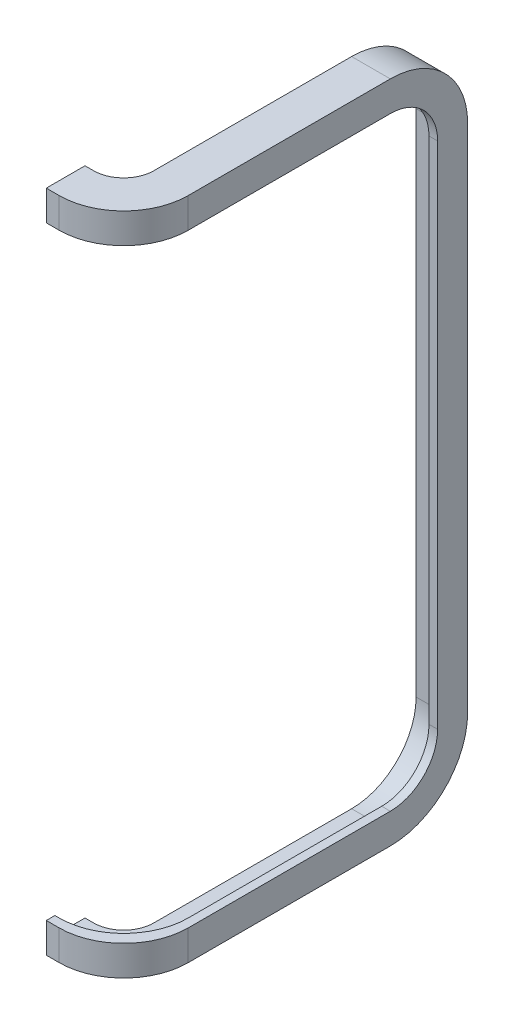
ISO-10303-21;
HEADER;
FILE_DESCRIPTION(('STEP AP214'),'2;1');
FILE_NAME('part.step','',(''),(''),'','','');
FILE_SCHEMA(('AUTOMOTIVE_DESIGN { 1 0 10303 214 1 1 1 1 }'));
ENDSEC;
DATA;
#1=APPLICATION_CONTEXT('core data for automotive mechanical design processes');
#2=APPLICATION_PROTOCOL_DEFINITION('international standard','automotive_design',2000,#1);
#3=PRODUCT_CONTEXT('',#1,'mechanical');
#4=PRODUCT('Part','Part','',(#3));
#5=PRODUCT_RELATED_PRODUCT_CATEGORY('part','',(#4));
#6=PRODUCT_DEFINITION_FORMATION('','',#4);
#7=PRODUCT_DEFINITION_CONTEXT('part definition',#1,'design');
#8=PRODUCT_DEFINITION('design','',#6,#7);
#9=PRODUCT_DEFINITION_SHAPE('','',#8);
#10=(LENGTH_UNIT() NAMED_UNIT(*) SI_UNIT(.MILLI.,.METRE.));
#11=(NAMED_UNIT(*) PLANE_ANGLE_UNIT() SI_UNIT($,.RADIAN.));
#12=(NAMED_UNIT(*) SI_UNIT($,.STERADIAN.) SOLID_ANGLE_UNIT());
#13=UNCERTAINTY_MEASURE_WITH_UNIT(LENGTH_MEASURE(1.E-05),#10,'distance_accuracy_value','');
#14=(GEOMETRIC_REPRESENTATION_CONTEXT(3) GLOBAL_UNCERTAINTY_ASSIGNED_CONTEXT((#13)) GLOBAL_UNIT_ASSIGNED_CONTEXT((#10,
#11,#12)) REPRESENTATION_CONTEXT('',''));
#15=CARTESIAN_POINT('',(0.,0.,0.));
#16=DIRECTION('',(0.,0.,1.));
#17=DIRECTION('',(1.,0.,0.));
#18=AXIS2_PLACEMENT_3D('',#15,#16,#17);
#19=CARTESIAN_POINT('',(112.5,-3.,0.));
#20=DIRECTION('',(0.,1.,0.));
#21=DIRECTION('',(0.,0.,1.));
#22=AXIS2_PLACEMENT_3D('',#19,#20,#21);
#23=PLANE('',#22);
#24=DIRECTION('',(0.,0.,-1.));
#25=VECTOR('',#24,1.);
#26=CARTESIAN_POINT('',(114.5,-3.,0.));
#27=LINE('',#26,#25);
#28=CARTESIAN_POINT('',(114.5,-3.,-13.));
#29=VERTEX_POINT('',#28);
#30=CARTESIAN_POINT('',(114.5,-3.,-60.));
#31=VERTEX_POINT('',#30);
#32=EDGE_CURVE('E316',#29,#31,#27,.T.);
#33=ORIENTED_EDGE('',*,*,#32,.F.);
#34=CARTESIAN_POINT('',(99.5,-3.,-13.));
#35=DIRECTION('',(0.,1.,0.));
#36=DIRECTION('',(0.,0.,1.));
#37=AXIS2_PLACEMENT_3D('',#34,#35,#36);
#38=CIRCLE('',#37,15.);
#39=CARTESIAN_POINT('',(99.5,-3.,2.00000000000001));
#40=VERTEX_POINT('',#39);
#41=EDGE_CURVE('E464',#29,#40,#38,.F.);
#42=ORIENTED_EDGE('',*,*,#41,.T.);
#43=DIRECTION('',(1.,0.,0.));
#44=VECTOR('',#43,1.);
#45=CARTESIAN_POINT('',(96.5,-3.,2.00000000000001));
#46=LINE('',#45,#44);
#47=CARTESIAN_POINT('',(96.5,-3.,2.00000000000001));
#48=VERTEX_POINT('',#47);
#49=EDGE_CURVE('E286',#48,#40,#46,.T.);
#50=ORIENTED_EDGE('',*,*,#49,.F.);
#51=DIRECTION('',(0.,0.,-1.));
#52=VECTOR('',#51,1.);
#53=CARTESIAN_POINT('',(96.5,-3.,-7.));
#54=LINE('',#53,#52);
#55=CARTESIAN_POINT('',(96.5,-3.,-7.));
#56=VERTEX_POINT('',#55);
#57=EDGE_CURVE('E306',#48,#56,#54,.T.);
#58=ORIENTED_EDGE('',*,*,#57,.T.);
#59=DIRECTION('',(1.,0.,0.));
#60=VECTOR('',#59,1.);
#61=CARTESIAN_POINT('',(96.5,-3.,-7.));
#62=LINE('',#61,#60);
#63=CARTESIAN_POINT('',(98.5,-3.,-7.));
#64=VERTEX_POINT('',#63);
#65=EDGE_CURVE('E310',#56,#64,#62,.T.);
#66=ORIENTED_EDGE('',*,*,#65,.T.);
#67=CARTESIAN_POINT('',(98.5,-3.,-14.));
#68=DIRECTION('',(0.,1.,0.));
#69=DIRECTION('',(0.,0.,1.));
#70=AXIS2_PLACEMENT_3D('',#67,#68,#69);
#71=CIRCLE('',#70,7.);
#72=CARTESIAN_POINT('',(105.5,-3.,-14.));
#73=VERTEX_POINT('',#72);
#74=EDGE_CURVE('E444',#64,#73,#71,.T.);
#75=ORIENTED_EDGE('',*,*,#74,.T.);
#76=DIRECTION('',(0.,0.,-1.));
#77=VECTOR('',#76,1.);
#78=CARTESIAN_POINT('',(105.5,-3.,0.));
#79=LINE('',#78,#77);
#80=CARTESIAN_POINT('',(105.5,-3.,-60.));
#81=VERTEX_POINT('',#80);
#82=EDGE_CURVE('E364',#73,#81,#79,.T.);
#83=ORIENTED_EDGE('',*,*,#82,.T.);
#84=DIRECTION('',(-1.,0.,0.));
#85=VECTOR('',#84,1.);
#86=CARTESIAN_POINT('',(112.5,-3.,-60.));
#87=LINE('',#86,#85);
#88=EDGE_CURVE('E425',#31,#81,#87,.T.);
#89=ORIENTED_EDGE('',*,*,#88,.F.);
#90=EDGE_LOOP('',(#33,#42,#50,#58,#66,#75,#83,#89));
#91=FACE_BOUND('',#90,.T.);
#92=ADVANCED_FACE('F39',(#91),#23,.F.);
#93=CARTESIAN_POINT('',(112.5,15.,-60.));
#94=DIRECTION('',(-1.,0.,0.));
#95=DIRECTION('',(0.,0.,1.));
#96=AXIS2_PLACEMENT_3D('',#93,#94,#95);
#97=CYLINDRICAL_SURFACE('',#96,18.);
#98=CARTESIAN_POINT('',(105.5,15.,-60.));
#99=DIRECTION('',(1.,0.,0.));
#100=DIRECTION('',(0.,0.,-1.));
#101=AXIS2_PLACEMENT_3D('',#98,#99,#100);
#102=CIRCLE('',#101,18.);
#103=CARTESIAN_POINT('',(105.5,15.,-78.));
#104=VERTEX_POINT('',#103);
#105=EDGE_CURVE('E382',#81,#104,#102,.T.);
#106=ORIENTED_EDGE('',*,*,#105,.T.);
#107=DIRECTION('',(-1.,0.,0.));
#108=VECTOR('',#107,1.);
#109=CARTESIAN_POINT('',(112.5,15.,-78.));
#110=LINE('',#109,#108);
#111=CARTESIAN_POINT('',(114.5,15.,-78.));
#112=VERTEX_POINT('',#111);
#113=EDGE_CURVE('E422',#112,#104,#110,.T.);
#114=ORIENTED_EDGE('',*,*,#113,.F.);
#115=CARTESIAN_POINT('',(114.5,15.,-60.));
#116=DIRECTION('',(1.,0.,0.));
#117=DIRECTION('',(0.,0.,-1.));
#118=AXIS2_PLACEMENT_3D('',#115,#116,#117);
#119=CIRCLE('',#118,18.);
#120=EDGE_CURVE('E318',#31,#112,#119,.T.);
#121=ORIENTED_EDGE('',*,*,#120,.F.);
#122=ORIENTED_EDGE('',*,*,#88,.T.);
#123=EDGE_LOOP('',(#106,#114,#121,#122));
#124=FACE_BOUND('',#123,.T.);
#125=ADVANCED_FACE('F569',(#124),#97,.T.);
#126=CARTESIAN_POINT('',(112.5,15.,-78.));
#127=DIRECTION('',(0.,0.,1.));
#128=DIRECTION('',(1.,0.,0.));
#129=AXIS2_PLACEMENT_3D('',#126,#127,#128);
#130=PLANE('',#129);
#131=DIRECTION('',(0.,1.,0.));
#132=VECTOR('',#131,1.);
#133=CARTESIAN_POINT('',(105.5,15.,-78.));
#134=LINE('',#133,#132);
#135=CARTESIAN_POINT('',(105.5,133.5,-78.));
#136=VERTEX_POINT('',#135);
#137=EDGE_CURVE('E384',#104,#136,#134,.T.);
#138=ORIENTED_EDGE('',*,*,#137,.T.);
#139=DIRECTION('',(-1.,0.,0.));
#140=VECTOR('',#139,1.);
#141=CARTESIAN_POINT('',(112.5,133.5,-78.));
#142=LINE('',#141,#140);
#143=CARTESIAN_POINT('',(114.5,133.5,-78.));
#144=VERTEX_POINT('',#143);
#145=EDGE_CURVE('E419',#144,#136,#142,.T.);
#146=ORIENTED_EDGE('',*,*,#145,.F.);
#147=DIRECTION('',(0.,1.,0.));
#148=VECTOR('',#147,1.);
#149=CARTESIAN_POINT('',(114.5,0.,-78.));
#150=LINE('',#149,#148);
#151=EDGE_CURVE('E322',#112,#144,#150,.T.);
#152=ORIENTED_EDGE('',*,*,#151,.F.);
#153=ORIENTED_EDGE('',*,*,#113,.T.);
#154=EDGE_LOOP('',(#138,#146,#152,#153));
#155=FACE_BOUND('',#154,.T.);
#156=ADVANCED_FACE('F571',(#155),#130,.F.);
#157=CARTESIAN_POINT('',(112.5,133.5,-60.));
#158=DIRECTION('',(-1.,0.,0.));
#159=DIRECTION('',(0.,0.,1.));
#160=AXIS2_PLACEMENT_3D('',#157,#158,#159);
#161=CYLINDRICAL_SURFACE('',#160,18.);
#162=CARTESIAN_POINT('',(105.5,133.5,-60.));
#163=DIRECTION('',(1.,0.,0.));
#164=DIRECTION('',(0.,0.,-1.));
#165=AXIS2_PLACEMENT_3D('',#162,#163,#164);
#166=CIRCLE('',#165,18.);
#167=CARTESIAN_POINT('',(105.5,151.5,-60.));
#168=VERTEX_POINT('',#167);
#169=EDGE_CURVE('E386',#136,#168,#166,.T.);
#170=ORIENTED_EDGE('',*,*,#169,.T.);
#171=DIRECTION('',(-1.,0.,0.));
#172=VECTOR('',#171,1.);
#173=CARTESIAN_POINT('',(112.5,151.5,-60.));
#174=LINE('',#173,#172);
#175=CARTESIAN_POINT('',(114.5,151.5,-60.));
#176=VERTEX_POINT('',#175);
#177=EDGE_CURVE('E416',#176,#168,#174,.T.);
#178=ORIENTED_EDGE('',*,*,#177,.F.);
#179=CARTESIAN_POINT('',(114.5,133.5,-60.));
#180=DIRECTION('',(1.,0.,0.));
#181=DIRECTION('',(0.,0.,-1.));
#182=AXIS2_PLACEMENT_3D('',#179,#180,#181);
#183=CIRCLE('',#182,18.);
#184=EDGE_CURVE('E325',#144,#176,#183,.T.);
#185=ORIENTED_EDGE('',*,*,#184,.F.);
#186=ORIENTED_EDGE('',*,*,#145,.T.);
#187=EDGE_LOOP('',(#170,#178,#185,#186));
#188=FACE_BOUND('',#187,.T.);
#189=ADVANCED_FACE('F486',(#188),#161,.T.);
#190=CARTESIAN_POINT('',(112.5,151.5,-60.));
#191=DIRECTION('',(0.,-1.,0.));
#192=DIRECTION('',(0.,0.,-1.));
#193=AXIS2_PLACEMENT_3D('',#190,#191,#192);
#194=PLANE('',#193);
#195=DIRECTION('',(1.,0.,0.));
#196=VECTOR('',#195,1.);
#197=CARTESIAN_POINT('',(96.5,151.5,2.00000000000002));
#198=LINE('',#197,#196);
#199=CARTESIAN_POINT('',(96.5,151.5,2.00000000000002));
#200=VERTEX_POINT('',#199);
#201=CARTESIAN_POINT('',(99.5,151.5,2.00000000000002));
#202=VERTEX_POINT('',#201);
#203=EDGE_CURVE('E241',#200,#202,#198,.T.);
#204=ORIENTED_EDGE('',*,*,#203,.T.);
#205=CARTESIAN_POINT('',(99.5,151.5,-13.));
#206=DIRECTION('',(0.,-1.,0.));
#207=DIRECTION('',(0.,0.,-1.));
#208=AXIS2_PLACEMENT_3D('',#205,#206,#207);
#209=CIRCLE('',#208,15.);
#210=CARTESIAN_POINT('',(114.5,151.5,-13.));
#211=VERTEX_POINT('',#210);
#212=EDGE_CURVE('E462',#202,#211,#209,.F.);
#213=ORIENTED_EDGE('',*,*,#212,.T.);
#214=DIRECTION('',(0.,0.,1.));
#215=VECTOR('',#214,1.);
#216=CARTESIAN_POINT('',(114.5,151.5,0.));
#217=LINE('',#216,#215);
#218=EDGE_CURVE('E328',#176,#211,#217,.T.);
#219=ORIENTED_EDGE('',*,*,#218,.F.);
#220=ORIENTED_EDGE('',*,*,#177,.T.);
#221=DIRECTION('',(0.,0.,1.));
#222=VECTOR('',#221,1.);
#223=CARTESIAN_POINT('',(105.5,151.5,-60.));
#224=LINE('',#223,#222);
#225=CARTESIAN_POINT('',(105.5,151.5,-14.));
#226=VERTEX_POINT('',#225);
#227=EDGE_CURVE('E388',#168,#226,#224,.T.);
#228=ORIENTED_EDGE('',*,*,#227,.T.);
#229=CARTESIAN_POINT('',(98.5,151.5,-14.));
#230=DIRECTION('',(0.,-1.,0.));
#231=DIRECTION('',(0.,0.,-1.));
#232=AXIS2_PLACEMENT_3D('',#229,#230,#231);
#233=CIRCLE('',#232,7.);
#234=CARTESIAN_POINT('',(98.5,151.5,-7.));
#235=VERTEX_POINT('',#234);
#236=EDGE_CURVE('E438',#226,#235,#233,.T.);
#237=ORIENTED_EDGE('',*,*,#236,.T.);
#238=DIRECTION('',(1.,0.,0.));
#239=VECTOR('',#238,1.);
#240=CARTESIAN_POINT('',(96.5,151.5,-7.));
#241=LINE('',#240,#239);
#242=CARTESIAN_POINT('',(96.5,151.5,-7.));
#243=VERTEX_POINT('',#242);
#244=EDGE_CURVE('E244',#243,#235,#241,.T.);
#245=ORIENTED_EDGE('',*,*,#244,.F.);
#246=DIRECTION('',(0.,0.,1.));
#247=VECTOR('',#246,1.);
#248=CARTESIAN_POINT('',(96.5,151.5,0.));
#249=LINE('',#248,#247);
#250=EDGE_CURVE('E238',#243,#200,#249,.T.);
#251=ORIENTED_EDGE('',*,*,#250,.T.);
#252=EDGE_LOOP('',(#204,#213,#219,#220,#228,#237,#245,#251));
#253=FACE_BOUND('',#252,.T.);
#254=ADVANCED_FACE('F240',(#253),#194,.F.);
#255=CARTESIAN_POINT('',(112.5,148.5,0.));
#256=DIRECTION('',(0.,1.,0.));
#257=DIRECTION('',(0.,0.,1.));
#258=AXIS2_PLACEMENT_3D('',#255,#256,#257);
#259=PLANE('',#258);
#260=DIRECTION('',(0.,0.,-1.));
#261=VECTOR('',#260,1.);
#262=CARTESIAN_POINT('',(112.5,148.5,0.));
#263=LINE('',#262,#261);
#264=CARTESIAN_POINT('',(112.5,148.5,-15.));
#265=VERTEX_POINT('',#264);
#266=CARTESIAN_POINT('',(112.5,148.5,-60.));
#267=VERTEX_POINT('',#266);
#268=EDGE_CURVE('E365',#265,#267,#263,.T.);
#269=ORIENTED_EDGE('',*,*,#268,.F.);
#270=CARTESIAN_POINT('',(97.5,148.5,-15.));
#271=DIRECTION('',(0.,1.,0.));
#272=DIRECTION('',(0.,0.,1.));
#273=AXIS2_PLACEMENT_3D('',#270,#271,#272);
#274=CIRCLE('',#273,15.);
#275=CARTESIAN_POINT('',(97.5,148.5,0.));
#276=VERTEX_POINT('',#275);
#277=EDGE_CURVE('E453',#265,#276,#274,.F.);
#278=ORIENTED_EDGE('',*,*,#277,.T.);
#279=DIRECTION('',(-1.,0.,0.));
#280=VECTOR('',#279,1.);
#281=CARTESIAN_POINT('',(112.5,148.5,0.));
#282=LINE('',#281,#280);
#283=CARTESIAN_POINT('',(96.5,148.5,0.));
#284=VERTEX_POINT('',#283);
#285=EDGE_CURVE('E414',#276,#284,#282,.T.);
#286=ORIENTED_EDGE('',*,*,#285,.T.);
#287=DIRECTION('',(0.,0.,-1.));
#288=VECTOR('',#287,1.);
#289=CARTESIAN_POINT('',(96.5,148.5,0.));
#290=LINE('',#289,#288);
#291=CARTESIAN_POINT('',(96.5,148.5,-7.));
#292=VERTEX_POINT('',#291);
#293=EDGE_CURVE('E289',#284,#292,#290,.T.);
#294=ORIENTED_EDGE('',*,*,#293,.T.);
#295=DIRECTION('',(1.,0.,0.));
#296=VECTOR('',#295,1.);
#297=CARTESIAN_POINT('',(96.5,148.5,-7.));
#298=LINE('',#297,#296);
#299=CARTESIAN_POINT('',(98.5,148.5,-7.));
#300=VERTEX_POINT('',#299);
#301=EDGE_CURVE('E249',#292,#300,#298,.T.);
#302=ORIENTED_EDGE('',*,*,#301,.T.);
#303=CARTESIAN_POINT('',(98.5,148.5,-14.));
#304=DIRECTION('',(0.,1.,0.));
#305=DIRECTION('',(0.,0.,1.));
#306=AXIS2_PLACEMENT_3D('',#303,#304,#305);
#307=CIRCLE('',#306,7.);
#308=CARTESIAN_POINT('',(105.5,148.5,-14.));
#309=VERTEX_POINT('',#308);
#310=EDGE_CURVE('E440',#300,#309,#307,.T.);
#311=ORIENTED_EDGE('',*,*,#310,.T.);
#312=DIRECTION('',(0.,0.,-1.));
#313=VECTOR('',#312,1.);
#314=CARTESIAN_POINT('',(105.5,148.5,0.));
#315=LINE('',#314,#313);
#316=CARTESIAN_POINT('',(105.5,148.5,-60.));
#317=VERTEX_POINT('',#316);
#318=EDGE_CURVE('E391',#309,#317,#315,.T.);
#319=ORIENTED_EDGE('',*,*,#318,.T.);
#320=DIRECTION('',(-1.,0.,0.));
#321=VECTOR('',#320,1.);
#322=CARTESIAN_POINT('',(112.5,148.5,-60.));
#323=LINE('',#322,#321);
#324=EDGE_CURVE('E411',#267,#317,#323,.T.);
#325=ORIENTED_EDGE('',*,*,#324,.F.);
#326=EDGE_LOOP('',(#269,#278,#286,#294,#302,#311,#319,#325));
#327=FACE_BOUND('',#326,.T.);
#328=ADVANCED_FACE('F503',(#327),#259,.F.);
#329=CARTESIAN_POINT('',(112.5,133.5,-60.));
#330=DIRECTION('',(-1.,0.,0.));
#331=DIRECTION('',(0.,0.,1.));
#332=AXIS2_PLACEMENT_3D('',#329,#330,#331);
#333=CYLINDRICAL_SURFACE('',#332,15.);
#334=CARTESIAN_POINT('',(105.5,133.5,-60.));
#335=DIRECTION('',(-1.,0.,0.));
#336=DIRECTION('',(0.,0.,-1.));
#337=AXIS2_PLACEMENT_3D('',#334,#335,#336);
#338=CIRCLE('',#337,15.);
#339=CARTESIAN_POINT('',(105.5,133.5,-75.));
#340=VERTEX_POINT('',#339);
#341=EDGE_CURVE('E393',#317,#340,#338,.T.);
#342=ORIENTED_EDGE('',*,*,#341,.T.);
#343=DIRECTION('',(-1.,0.,0.));
#344=VECTOR('',#343,1.);
#345=CARTESIAN_POINT('',(112.5,133.5,-75.));
#346=LINE('',#345,#344);
#347=CARTESIAN_POINT('',(112.5,133.5,-75.));
#348=VERTEX_POINT('',#347);
#349=EDGE_CURVE('E408',#348,#340,#346,.T.);
#350=ORIENTED_EDGE('',*,*,#349,.F.);
#351=CARTESIAN_POINT('',(112.5,133.5,-60.));
#352=DIRECTION('',(-1.,0.,0.));
#353=DIRECTION('',(0.,0.,-1.));
#354=AXIS2_PLACEMENT_3D('',#351,#352,#353);
#355=CIRCLE('',#354,15.);
#356=EDGE_CURVE('E367',#267,#348,#355,.T.);
#357=ORIENTED_EDGE('',*,*,#356,.F.);
#358=ORIENTED_EDGE('',*,*,#324,.T.);
#359=EDGE_LOOP('',(#342,#350,#357,#358));
#360=FACE_BOUND('',#359,.T.);
#361=ADVANCED_FACE('F709',(#360),#333,.F.);
#362=CARTESIAN_POINT('',(112.5,15.,-75.));
#363=DIRECTION('',(0.,0.,-1.));
#364=DIRECTION('',(0.,1.,0.));
#365=AXIS2_PLACEMENT_3D('',#362,#363,#364);
#366=PLANE('',#365);
#367=DIRECTION('',(0.,-1.,0.));
#368=VECTOR('',#367,1.);
#369=CARTESIAN_POINT('',(105.5,15.,-75.));
#370=LINE('',#369,#368);
#371=CARTESIAN_POINT('',(105.5,15.,-75.));
#372=VERTEX_POINT('',#371);
#373=EDGE_CURVE('E395',#340,#372,#370,.T.);
#374=ORIENTED_EDGE('',*,*,#373,.T.);
#375=DIRECTION('',(-1.,0.,0.));
#376=VECTOR('',#375,1.);
#377=CARTESIAN_POINT('',(112.5,15.,-75.));
#378=LINE('',#377,#376);
#379=CARTESIAN_POINT('',(112.5,15.,-75.));
#380=VERTEX_POINT('',#379);
#381=EDGE_CURVE('E405',#380,#372,#378,.T.);
#382=ORIENTED_EDGE('',*,*,#381,.F.);
#383=DIRECTION('',(0.,-1.,0.));
#384=VECTOR('',#383,1.);
#385=CARTESIAN_POINT('',(112.5,15.,-75.));
#386=LINE('',#385,#384);
#387=EDGE_CURVE('E371',#348,#380,#386,.T.);
#388=ORIENTED_EDGE('',*,*,#387,.F.);
#389=ORIENTED_EDGE('',*,*,#349,.T.);
#390=EDGE_LOOP('',(#374,#382,#388,#389));
#391=FACE_BOUND('',#390,.T.);
#392=ADVANCED_FACE('F797',(#391),#366,.F.);
#393=CARTESIAN_POINT('',(112.5,15.,-60.));
#394=DIRECTION('',(-1.,0.,0.));
#395=DIRECTION('',(0.,0.,1.));
#396=AXIS2_PLACEMENT_3D('',#393,#394,#395);
#397=CYLINDRICAL_SURFACE('',#396,15.);
#398=CARTESIAN_POINT('',(105.5,15.,-60.));
#399=DIRECTION('',(-1.,0.,0.));
#400=DIRECTION('',(0.,0.,-1.));
#401=AXIS2_PLACEMENT_3D('',#398,#399,#400);
#402=CIRCLE('',#401,15.);
#403=CARTESIAN_POINT('',(105.5,0.,-60.));
#404=VERTEX_POINT('',#403);
#405=EDGE_CURVE('E397',#372,#404,#402,.T.);
#406=ORIENTED_EDGE('',*,*,#405,.T.);
#407=DIRECTION('',(-1.,0.,0.));
#408=VECTOR('',#407,1.);
#409=CARTESIAN_POINT('',(112.5,0.,-60.));
#410=LINE('',#409,#408);
#411=CARTESIAN_POINT('',(112.5,0.,-60.));
#412=VERTEX_POINT('',#411);
#413=EDGE_CURVE('E402',#412,#404,#410,.T.);
#414=ORIENTED_EDGE('',*,*,#413,.F.);
#415=CARTESIAN_POINT('',(112.5,15.,-60.));
#416=DIRECTION('',(-1.,0.,0.));
#417=DIRECTION('',(0.,0.,-1.));
#418=AXIS2_PLACEMENT_3D('',#415,#416,#417);
#419=CIRCLE('',#418,15.);
#420=EDGE_CURVE('E374',#380,#412,#419,.T.);
#421=ORIENTED_EDGE('',*,*,#420,.F.);
#422=ORIENTED_EDGE('',*,*,#381,.T.);
#423=EDGE_LOOP('',(#406,#414,#421,#422));
#424=FACE_BOUND('',#423,.T.);
#425=ADVANCED_FACE('F698',(#424),#397,.F.);
#426=CARTESIAN_POINT('',(112.5,0.,0.));
#427=DIRECTION('',(0.,-1.,0.));
#428=DIRECTION('',(0.,0.,-1.));
#429=AXIS2_PLACEMENT_3D('',#426,#427,#428);
#430=PLANE('',#429);
#431=DIRECTION('',(-1.,0.,0.));
#432=VECTOR('',#431,1.);
#433=CARTESIAN_POINT('',(112.5,0.,0.));
#434=LINE('',#433,#432);
#435=CARTESIAN_POINT('',(97.5,0.,0.));
#436=VERTEX_POINT('',#435);
#437=CARTESIAN_POINT('',(96.5,0.,0.));
#438=VERTEX_POINT('',#437);
#439=EDGE_CURVE('E380',#436,#438,#434,.T.);
#440=ORIENTED_EDGE('',*,*,#439,.F.);
#441=CARTESIAN_POINT('',(97.5,0.,-15.));
#442=DIRECTION('',(0.,-1.,0.));
#443=DIRECTION('',(0.,0.,-1.));
#444=AXIS2_PLACEMENT_3D('',#441,#442,#443);
#445=CIRCLE('',#444,15.);
#446=CARTESIAN_POINT('',(112.5,0.,-15.));
#447=VERTEX_POINT('',#446);
#448=EDGE_CURVE('E62',#436,#447,#445,.F.);
#449=ORIENTED_EDGE('',*,*,#448,.T.);
#450=DIRECTION('',(0.,0.,1.));
#451=VECTOR('',#450,1.);
#452=CARTESIAN_POINT('',(112.5,0.,0.));
#453=LINE('',#452,#451);
#454=EDGE_CURVE('E377',#412,#447,#453,.T.);
#455=ORIENTED_EDGE('',*,*,#454,.F.);
#456=ORIENTED_EDGE('',*,*,#413,.T.);
#457=DIRECTION('',(0.,0.,1.));
#458=VECTOR('',#457,1.);
#459=CARTESIAN_POINT('',(105.5,0.,0.));
#460=LINE('',#459,#458);
#461=CARTESIAN_POINT('',(105.5,0.,-14.));
#462=VERTEX_POINT('',#461);
#463=EDGE_CURVE('E368',#404,#462,#460,.T.);
#464=ORIENTED_EDGE('',*,*,#463,.T.);
#465=CARTESIAN_POINT('',(98.5,0.,-14.));
#466=DIRECTION('',(0.,-1.,0.));
#467=DIRECTION('',(0.,0.,-1.));
#468=AXIS2_PLACEMENT_3D('',#465,#466,#467);
#469=CIRCLE('',#468,7.);
#470=CARTESIAN_POINT('',(98.5,0.,-7.));
#471=VERTEX_POINT('',#470);
#472=EDGE_CURVE('E442',#462,#471,#469,.T.);
#473=ORIENTED_EDGE('',*,*,#472,.T.);
#474=DIRECTION('',(1.,0.,0.));
#475=VECTOR('',#474,1.);
#476=CARTESIAN_POINT('',(96.5,0.,-7.));
#477=LINE('',#476,#475);
#478=CARTESIAN_POINT('',(96.5,0.,-7.));
#479=VERTEX_POINT('',#478);
#480=EDGE_CURVE('E309',#479,#471,#477,.T.);
#481=ORIENTED_EDGE('',*,*,#480,.F.);
#482=DIRECTION('',(0.,0.,1.));
#483=VECTOR('',#482,1.);
#484=CARTESIAN_POINT('',(96.5,0.,-7.));
#485=LINE('',#484,#483);
#486=EDGE_CURVE('E303',#479,#438,#485,.T.);
#487=ORIENTED_EDGE('',*,*,#486,.T.);
#488=EDGE_LOOP('',(#440,#449,#455,#456,#464,#473,#481,#487));
#489=FACE_BOUND('',#488,.T.);
#490=ADVANCED_FACE('F554',(#489),#430,.F.);
#491=CARTESIAN_POINT('',(105.5,15.,-60.));
#492=DIRECTION('',(1.,0.,0.));
#493=DIRECTION('',(0.,0.,-1.));
#494=AXIS2_PLACEMENT_3D('',#491,#492,#493);
#495=PLANE('',#494);
#496=ORIENTED_EDGE('',*,*,#318,.F.);
#497=DIRECTION('',(0.,1.,0.));
#498=VECTOR('',#497,1.);
#499=CARTESIAN_POINT('',(105.5,15.,-14.));
#500=LINE('',#499,#498);
#501=EDGE_CURVE('E431',#309,#226,#500,.T.);
#502=ORIENTED_EDGE('',*,*,#501,.T.);
#503=ORIENTED_EDGE('',*,*,#227,.F.);
#504=ORIENTED_EDGE('',*,*,#169,.F.);
#505=ORIENTED_EDGE('',*,*,#137,.F.);
#506=ORIENTED_EDGE('',*,*,#105,.F.);
#507=ORIENTED_EDGE('',*,*,#82,.F.);
#508=DIRECTION('',(0.,1.,0.));
#509=VECTOR('',#508,1.);
#510=CARTESIAN_POINT('',(105.5,15.,-14.));
#511=LINE('',#510,#509);
#512=EDGE_CURVE('E428',#73,#462,#511,.T.);
#513=ORIENTED_EDGE('',*,*,#512,.T.);
#514=ORIENTED_EDGE('',*,*,#463,.F.);
#515=ORIENTED_EDGE('',*,*,#405,.F.);
#516=ORIENTED_EDGE('',*,*,#373,.F.);
#517=ORIENTED_EDGE('',*,*,#341,.F.);
#518=EDGE_LOOP('',(#496,#502,#503,#504,#505,#506,#507,#513,#514,#515,#516,#517));
#519=FACE_BOUND('',#518,.T.);
#520=ADVANCED_FACE('F491',(#519),#495,.F.);
#521=CARTESIAN_POINT('',(112.5,0.,0.));
#522=DIRECTION('',(1.,0.,0.));
#523=DIRECTION('',(0.,0.,-1.));
#524=AXIS2_PLACEMENT_3D('',#521,#522,#523);
#525=PLANE('',#524);
#526=DIRECTION('',(0.,0.,-1.));
#527=VECTOR('',#526,1.);
#528=CARTESIAN_POINT('',(112.5,144.5,0.));
#529=LINE('',#528,#527);
#530=CARTESIAN_POINT('',(112.5,144.5,-15.));
#531=VERTEX_POINT('',#530);
#532=CARTESIAN_POINT('',(112.5,144.5,-60.));
#533=VERTEX_POINT('',#532);
#534=EDGE_CURVE('E313',#531,#533,#529,.T.);
#535=ORIENTED_EDGE('',*,*,#534,.F.);
#536=DIRECTION('',(0.,-1.,0.));
#537=VECTOR('',#536,1.);
#538=CARTESIAN_POINT('',(112.5,0.,-15.));
#539=LINE('',#538,#537);
#540=EDGE_CURVE('E451',#531,#265,#539,.F.);
#541=ORIENTED_EDGE('',*,*,#540,.T.);
#542=ORIENTED_EDGE('',*,*,#268,.T.);
#543=ORIENTED_EDGE('',*,*,#356,.T.);
#544=ORIENTED_EDGE('',*,*,#387,.T.);
#545=ORIENTED_EDGE('',*,*,#420,.T.);
#546=ORIENTED_EDGE('',*,*,#454,.T.);
#547=DIRECTION('',(0.,-1.,0.));
#548=VECTOR('',#547,1.);
#549=CARTESIAN_POINT('',(112.5,0.,-15.));
#550=LINE('',#549,#548);
#551=CARTESIAN_POINT('',(112.5,4.,-15.));
#552=VERTEX_POINT('',#551);
#553=EDGE_CURVE('E449',#447,#552,#550,.F.);
#554=ORIENTED_EDGE('',*,*,#553,.T.);
#555=DIRECTION('',(0.,0.,1.));
#556=VECTOR('',#555,1.);
#557=CARTESIAN_POINT('',(112.5,4.,0.));
#558=LINE('',#557,#556);
#559=CARTESIAN_POINT('',(112.5,4.,-60.));
#560=VERTEX_POINT('',#559);
#561=EDGE_CURVE('E319',#560,#552,#558,.T.);
#562=ORIENTED_EDGE('',*,*,#561,.F.);
#563=CARTESIAN_POINT('',(112.5,15.,-60.));
#564=DIRECTION('',(1.,0.,0.));
#565=DIRECTION('',(0.,0.,-1.));
#566=AXIS2_PLACEMENT_3D('',#563,#564,#565);
#567=CIRCLE('',#566,11.);
#568=CARTESIAN_POINT('',(112.5,15.,-71.));
#569=VERTEX_POINT('',#568);
#570=EDGE_CURVE('E352',#560,#569,#567,.T.);
#571=ORIENTED_EDGE('',*,*,#570,.T.);
#572=DIRECTION('',(0.,-1.,0.));
#573=VECTOR('',#572,1.);
#574=CARTESIAN_POINT('',(112.5,0.,-71.));
#575=LINE('',#574,#573);
#576=CARTESIAN_POINT('',(112.5,133.5,-71.));
#577=VERTEX_POINT('',#576);
#578=EDGE_CURVE('E349',#577,#569,#575,.T.);
#579=ORIENTED_EDGE('',*,*,#578,.F.);
#580=CARTESIAN_POINT('',(112.5,133.5,-60.));
#581=DIRECTION('',(1.,0.,0.));
#582=DIRECTION('',(0.,0.,-1.));
#583=AXIS2_PLACEMENT_3D('',#580,#581,#582);
#584=CIRCLE('',#583,11.);
#585=EDGE_CURVE('E346',#577,#533,#584,.T.);
#586=ORIENTED_EDGE('',*,*,#585,.T.);
#587=EDGE_LOOP('',(#535,#541,#542,#543,#544,#545,#546,#554,#562,#571,#579,#586));
#588=FACE_BOUND('',#587,.T.);
#589=ADVANCED_FACE('F514',(#588),#525,.F.);
#590=CARTESIAN_POINT('',(114.5,144.5,0.));
#591=DIRECTION('',(0.,1.,0.));
#592=DIRECTION('',(0.,0.,1.));
#593=AXIS2_PLACEMENT_3D('',#590,#591,#592);
#594=PLANE('',#593);
#595=DIRECTION('',(0.,0.,-1.));
#596=VECTOR('',#595,1.);
#597=CARTESIAN_POINT('',(114.5,144.5,0.));
#598=LINE('',#597,#596);
#599=CARTESIAN_POINT('',(114.5,144.5,-13.));
#600=VERTEX_POINT('',#599);
#601=CARTESIAN_POINT('',(114.5,144.5,-60.));
#602=VERTEX_POINT('',#601);
#603=EDGE_CURVE('E331',#600,#602,#598,.T.);
#604=ORIENTED_EDGE('',*,*,#603,.F.);
#605=CARTESIAN_POINT('',(99.5,144.5,-13.));
#606=DIRECTION('',(0.,1.,0.));
#607=DIRECTION('',(0.,0.,1.));
#608=AXIS2_PLACEMENT_3D('',#605,#606,#607);
#609=CIRCLE('',#608,15.);
#610=CARTESIAN_POINT('',(99.5,144.5,2.00000000000002));
#611=VERTEX_POINT('',#610);
#612=EDGE_CURVE('E47',#600,#611,#609,.F.);
#613=ORIENTED_EDGE('',*,*,#612,.T.);
#614=DIRECTION('',(1.,0.,0.));
#615=VECTOR('',#614,1.);
#616=CARTESIAN_POINT('',(96.5,144.5,2.00000000000002));
#617=LINE('',#616,#615);
#618=CARTESIAN_POINT('',(96.5,144.5,2.00000000000002));
#619=VERTEX_POINT('',#618);
#620=EDGE_CURVE('E260',#619,#611,#617,.T.);
#621=ORIENTED_EDGE('',*,*,#620,.F.);
#622=DIRECTION('',(0.,0.,-1.));
#623=VECTOR('',#622,1.);
#624=CARTESIAN_POINT('',(96.5,144.5,0.));
#625=LINE('',#624,#623);
#626=CARTESIAN_POINT('',(96.5,144.5,0.));
#627=VERTEX_POINT('',#626);
#628=EDGE_CURVE('E261',#619,#627,#625,.T.);
#629=ORIENTED_EDGE('',*,*,#628,.T.);
#630=DIRECTION('',(1.,0.,0.));
#631=VECTOR('',#630,1.);
#632=CARTESIAN_POINT('',(96.5,144.5,0.));
#633=LINE('',#632,#631);
#634=CARTESIAN_POINT('',(97.5,144.5,0.));
#635=VERTEX_POINT('',#634);
#636=EDGE_CURVE('E273',#627,#635,#633,.T.);
#637=ORIENTED_EDGE('',*,*,#636,.T.);
#638=CARTESIAN_POINT('',(97.5,144.5,-15.));
#639=DIRECTION('',(0.,1.,0.));
#640=DIRECTION('',(0.,0.,1.));
#641=AXIS2_PLACEMENT_3D('',#638,#639,#640);
#642=CIRCLE('',#641,15.);
#643=EDGE_CURVE('E471',#635,#531,#642,.T.);
#644=ORIENTED_EDGE('',*,*,#643,.T.);
#645=ORIENTED_EDGE('',*,*,#534,.T.);
#646=DIRECTION('',(-1.,0.,0.));
#647=VECTOR('',#646,1.);
#648=CARTESIAN_POINT('',(114.5,144.5,-60.));
#649=LINE('',#648,#647);
#650=EDGE_CURVE('E361',#602,#533,#649,.T.);
#651=ORIENTED_EDGE('',*,*,#650,.F.);
#652=EDGE_LOOP('',(#604,#613,#621,#629,#637,#644,#645,#651));
#653=FACE_BOUND('',#652,.T.);
#654=ADVANCED_FACE('F475',(#653),#594,.F.);
#655=CARTESIAN_POINT('',(114.5,133.5,-60.));
#656=DIRECTION('',(-1.,0.,0.));
#657=DIRECTION('',(0.,0.,1.));
#658=AXIS2_PLACEMENT_3D('',#655,#656,#657);
#659=CYLINDRICAL_SURFACE('',#658,11.);
#660=ORIENTED_EDGE('',*,*,#585,.F.);
#661=DIRECTION('',(-1.,0.,0.));
#662=VECTOR('',#661,1.);
#663=CARTESIAN_POINT('',(114.5,133.5,-71.));
#664=LINE('',#663,#662);
#665=CARTESIAN_POINT('',(114.5,133.5,-71.));
#666=VERTEX_POINT('',#665);
#667=EDGE_CURVE('E359',#666,#577,#664,.T.);
#668=ORIENTED_EDGE('',*,*,#667,.F.);
#669=CARTESIAN_POINT('',(114.5,133.5,-60.));
#670=DIRECTION('',(1.,0.,0.));
#671=DIRECTION('',(0.,0.,-1.));
#672=AXIS2_PLACEMENT_3D('',#669,#670,#671);
#673=CIRCLE('',#672,11.);
#674=EDGE_CURVE('E333',#666,#602,#673,.T.);
#675=ORIENTED_EDGE('',*,*,#674,.T.);
#676=ORIENTED_EDGE('',*,*,#650,.T.);
#677=EDGE_LOOP('',(#660,#668,#675,#676));
#678=FACE_BOUND('',#677,.T.);
#679=ADVANCED_FACE('F518',(#678),#659,.F.);
#680=CARTESIAN_POINT('',(114.5,0.,-71.));
#681=DIRECTION('',(0.,0.,-1.));
#682=DIRECTION('',(-1.,0.,0.));
#683=AXIS2_PLACEMENT_3D('',#680,#681,#682);
#684=PLANE('',#683);
#685=ORIENTED_EDGE('',*,*,#578,.T.);
#686=DIRECTION('',(-1.,0.,0.));
#687=VECTOR('',#686,1.);
#688=CARTESIAN_POINT('',(114.5,15.,-71.));
#689=LINE('',#688,#687);
#690=CARTESIAN_POINT('',(114.5,15.,-71.));
#691=VERTEX_POINT('',#690);
#692=EDGE_CURVE('E357',#691,#569,#689,.T.);
#693=ORIENTED_EDGE('',*,*,#692,.F.);
#694=DIRECTION('',(0.,-1.,0.));
#695=VECTOR('',#694,1.);
#696=CARTESIAN_POINT('',(114.5,0.,-71.));
#697=LINE('',#696,#695);
#698=EDGE_CURVE('E336',#666,#691,#697,.T.);
#699=ORIENTED_EDGE('',*,*,#698,.F.);
#700=ORIENTED_EDGE('',*,*,#667,.T.);
#701=EDGE_LOOP('',(#685,#693,#699,#700));
#702=FACE_BOUND('',#701,.T.);
#703=ADVANCED_FACE('F524',(#702),#684,.F.);
#704=CARTESIAN_POINT('',(114.5,15.,-60.));
#705=DIRECTION('',(-1.,0.,0.));
#706=DIRECTION('',(0.,0.,1.));
#707=AXIS2_PLACEMENT_3D('',#704,#705,#706);
#708=CYLINDRICAL_SURFACE('',#707,11.);
#709=ORIENTED_EDGE('',*,*,#570,.F.);
#710=DIRECTION('',(-1.,0.,0.));
#711=VECTOR('',#710,1.);
#712=CARTESIAN_POINT('',(114.5,4.,-60.));
#713=LINE('',#712,#711);
#714=CARTESIAN_POINT('',(114.5,4.,-60.));
#715=VERTEX_POINT('',#714);
#716=EDGE_CURVE('E344',#715,#560,#713,.T.);
#717=ORIENTED_EDGE('',*,*,#716,.F.);
#718=CARTESIAN_POINT('',(114.5,15.,-60.));
#719=DIRECTION('',(1.,0.,0.));
#720=DIRECTION('',(0.,0.,-1.));
#721=AXIS2_PLACEMENT_3D('',#718,#719,#720);
#722=CIRCLE('',#721,11.);
#723=EDGE_CURVE('E338',#715,#691,#722,.T.);
#724=ORIENTED_EDGE('',*,*,#723,.T.);
#725=ORIENTED_EDGE('',*,*,#692,.T.);
#726=EDGE_LOOP('',(#709,#717,#724,#725));
#727=FACE_BOUND('',#726,.T.);
#728=ADVANCED_FACE('F527',(#727),#708,.F.);
#729=CARTESIAN_POINT('',(114.5,4.,0.));
#730=DIRECTION('',(0.,-1.,0.));
#731=DIRECTION('',(0.,0.,-1.));
#732=AXIS2_PLACEMENT_3D('',#729,#730,#731);
#733=PLANE('',#732);
#734=DIRECTION('',(1.,0.,0.));
#735=VECTOR('',#734,1.);
#736=CARTESIAN_POINT('',(96.5,4.,2.));
#737=LINE('',#736,#735);
#738=CARTESIAN_POINT('',(96.5,4.,2.));
#739=VERTEX_POINT('',#738);
#740=CARTESIAN_POINT('',(99.5,4.,2.));
#741=VERTEX_POINT('',#740);
#742=EDGE_CURVE('E290',#739,#741,#737,.T.);
#743=ORIENTED_EDGE('',*,*,#742,.T.);
#744=CARTESIAN_POINT('',(99.5,4.,-13.));
#745=DIRECTION('',(0.,-1.,0.));
#746=DIRECTION('',(0.,0.,-1.));
#747=AXIS2_PLACEMENT_3D('',#744,#745,#746);
#748=CIRCLE('',#747,15.);
#749=CARTESIAN_POINT('',(114.5,4.,-13.));
#750=VERTEX_POINT('',#749);
#751=EDGE_CURVE('E11',#741,#750,#748,.F.);
#752=ORIENTED_EDGE('',*,*,#751,.T.);
#753=DIRECTION('',(0.,0.,1.));
#754=VECTOR('',#753,1.);
#755=CARTESIAN_POINT('',(114.5,4.,0.));
#756=LINE('',#755,#754);
#757=EDGE_CURVE('E341',#715,#750,#756,.T.);
#758=ORIENTED_EDGE('',*,*,#757,.F.);
#759=ORIENTED_EDGE('',*,*,#716,.T.);
#760=ORIENTED_EDGE('',*,*,#561,.T.);
#761=CARTESIAN_POINT('',(97.5,4.,-15.));
#762=DIRECTION('',(0.,-1.,0.));
#763=DIRECTION('',(0.,0.,-1.));
#764=AXIS2_PLACEMENT_3D('',#761,#762,#763);
#765=CIRCLE('',#764,15.);
#766=CARTESIAN_POINT('',(97.5,4.,0.));
#767=VERTEX_POINT('',#766);
#768=EDGE_CURVE('E54',#552,#767,#765,.T.);
#769=ORIENTED_EDGE('',*,*,#768,.T.);
#770=DIRECTION('',(1.,0.,0.));
#771=VECTOR('',#770,1.);
#772=CARTESIAN_POINT('',(96.5,4.,0.));
#773=LINE('',#772,#771);
#774=CARTESIAN_POINT('',(96.5,4.,0.));
#775=VERTEX_POINT('',#774);
#776=EDGE_CURVE('E285',#775,#767,#773,.T.);
#777=ORIENTED_EDGE('',*,*,#776,.F.);
#778=DIRECTION('',(0.,0.,1.));
#779=VECTOR('',#778,1.);
#780=CARTESIAN_POINT('',(96.5,4.,0.));
#781=LINE('',#780,#779);
#782=EDGE_CURVE('E279',#775,#739,#781,.T.);
#783=ORIENTED_EDGE('',*,*,#782,.T.);
#784=EDGE_LOOP('',(#743,#752,#758,#759,#760,#769,#777,#783));
#785=FACE_BOUND('',#784,.T.);
#786=ADVANCED_FACE('F530',(#785),#733,.F.);
#787=CARTESIAN_POINT('',(114.5,0.,0.));
#788=DIRECTION('',(1.,0.,0.));
#789=DIRECTION('',(0.,0.,-1.));
#790=AXIS2_PLACEMENT_3D('',#787,#788,#789);
#791=PLANE('',#790);
#792=ORIENTED_EDGE('',*,*,#218,.T.);
#793=DIRECTION('',(0.,-1.,0.));
#794=VECTOR('',#793,1.);
#795=CARTESIAN_POINT('',(114.5,0.,-13.));
#796=LINE('',#795,#794);
#797=EDGE_CURVE('E458',#211,#600,#796,.T.);
#798=ORIENTED_EDGE('',*,*,#797,.T.);
#799=ORIENTED_EDGE('',*,*,#603,.T.);
#800=ORIENTED_EDGE('',*,*,#674,.F.);
#801=ORIENTED_EDGE('',*,*,#698,.T.);
#802=ORIENTED_EDGE('',*,*,#723,.F.);
#803=ORIENTED_EDGE('',*,*,#757,.T.);
#804=DIRECTION('',(0.,-1.,0.));
#805=VECTOR('',#804,1.);
#806=CARTESIAN_POINT('',(114.5,0.,-13.));
#807=LINE('',#806,#805);
#808=EDGE_CURVE('E455',#750,#29,#807,.T.);
#809=ORIENTED_EDGE('',*,*,#808,.T.);
#810=ORIENTED_EDGE('',*,*,#32,.T.);
#811=ORIENTED_EDGE('',*,*,#120,.T.);
#812=ORIENTED_EDGE('',*,*,#151,.T.);
#813=ORIENTED_EDGE('',*,*,#184,.T.);
#814=EDGE_LOOP('',(#792,#798,#799,#800,#801,#802,#803,#809,#810,#811,#812,#813));
#815=FACE_BOUND('',#814,.T.);
#816=ADVANCED_FACE('F482',(#815),#791,.T.);
#817=CARTESIAN_POINT('',(96.5,-3.,-7.));
#818=DIRECTION('',(0.,0.,-1.));
#819=DIRECTION('',(-1.,0.,0.));
#820=AXIS2_PLACEMENT_3D('',#817,#818,#819);
#821=PLANE('',#820);
#822=ORIENTED_EDGE('',*,*,#480,.T.);
#823=DIRECTION('',(0.,1.,0.));
#824=VECTOR('',#823,1.);
#825=CARTESIAN_POINT('',(98.5,-3.,-7.));
#826=LINE('',#825,#824);
#827=EDGE_CURVE('E436',#471,#64,#826,.F.);
#828=ORIENTED_EDGE('',*,*,#827,.T.);
#829=ORIENTED_EDGE('',*,*,#65,.F.);
#830=DIRECTION('',(0.,1.,0.));
#831=VECTOR('',#830,1.);
#832=CARTESIAN_POINT('',(96.5,-3.,-7.));
#833=LINE('',#832,#831);
#834=EDGE_CURVE('E298',#56,#479,#833,.T.);
#835=ORIENTED_EDGE('',*,*,#834,.T.);
#836=EDGE_LOOP('',(#822,#828,#829,#835));
#837=FACE_BOUND('',#836,.T.);
#838=ADVANCED_FACE('F558',(#837),#821,.T.);
#839=CARTESIAN_POINT('',(96.5,0.,0.));
#840=DIRECTION('',(1.,0.,0.));
#841=DIRECTION('',(0.,0.,-1.));
#842=AXIS2_PLACEMENT_3D('',#839,#840,#841);
#843=PLANE('',#842);
#844=ORIENTED_EDGE('',*,*,#834,.F.);
#845=ORIENTED_EDGE('',*,*,#57,.F.);
#846=DIRECTION('',(0.,-1.,0.));
#847=VECTOR('',#846,1.);
#848=CARTESIAN_POINT('',(96.5,4.,2.));
#849=LINE('',#848,#847);
#850=EDGE_CURVE('E282',#739,#48,#849,.T.);
#851=ORIENTED_EDGE('',*,*,#850,.F.);
#852=ORIENTED_EDGE('',*,*,#782,.F.);
#853=DIRECTION('',(0.,1.,0.));
#854=VECTOR('',#853,1.);
#855=CARTESIAN_POINT('',(96.5,4.,0.));
#856=LINE('',#855,#854);
#857=EDGE_CURVE('E276',#438,#775,#856,.T.);
#858=ORIENTED_EDGE('',*,*,#857,.F.);
#859=ORIENTED_EDGE('',*,*,#486,.F.);
#860=EDGE_LOOP('',(#844,#845,#851,#852,#858,#859));
#861=FACE_BOUND('',#860,.T.);
#862=ADVANCED_FACE('F546',(#861),#843,.F.);
#863=CARTESIAN_POINT('',(96.5,151.5,-7.));
#864=DIRECTION('',(0.,0.,-1.));
#865=DIRECTION('',(-1.,0.,0.));
#866=AXIS2_PLACEMENT_3D('',#863,#864,#865);
#867=PLANE('',#866);
#868=ORIENTED_EDGE('',*,*,#244,.T.);
#869=DIRECTION('',(0.,1.,0.));
#870=VECTOR('',#869,1.);
#871=CARTESIAN_POINT('',(98.5,151.5,-7.));
#872=LINE('',#871,#870);
#873=EDGE_CURVE('E434',#235,#300,#872,.F.);
#874=ORIENTED_EDGE('',*,*,#873,.T.);
#875=ORIENTED_EDGE('',*,*,#301,.F.);
#876=DIRECTION('',(0.,1.,0.));
#877=VECTOR('',#876,1.);
#878=CARTESIAN_POINT('',(96.5,151.5,-7.));
#879=LINE('',#878,#877);
#880=EDGE_CURVE('E250',#292,#243,#879,.T.);
#881=ORIENTED_EDGE('',*,*,#880,.T.);
#882=EDGE_LOOP('',(#868,#874,#875,#881));
#883=FACE_BOUND('',#882,.T.);
#884=ADVANCED_FACE('F500',(#883),#867,.T.);
#885=CARTESIAN_POINT('',(96.5,0.,0.));
#886=DIRECTION('',(1.,0.,0.));
#887=DIRECTION('',(0.,0.,-1.));
#888=AXIS2_PLACEMENT_3D('',#885,#886,#887);
#889=PLANE('',#888);
#890=ORIENTED_EDGE('',*,*,#293,.F.);
#891=DIRECTION('',(0.,1.,0.));
#892=VECTOR('',#891,1.);
#893=CARTESIAN_POINT('',(96.5,151.5,0.));
#894=LINE('',#893,#892);
#895=EDGE_CURVE('E267',#627,#284,#894,.T.);
#896=ORIENTED_EDGE('',*,*,#895,.F.);
#897=ORIENTED_EDGE('',*,*,#628,.F.);
#898=DIRECTION('',(0.,-1.,0.));
#899=VECTOR('',#898,1.);
#900=CARTESIAN_POINT('',(96.5,151.5,2.00000000000002));
#901=LINE('',#900,#899);
#902=EDGE_CURVE('E256',#200,#619,#901,.T.);
#903=ORIENTED_EDGE('',*,*,#902,.F.);
#904=ORIENTED_EDGE('',*,*,#250,.F.);
#905=ORIENTED_EDGE('',*,*,#880,.F.);
#906=EDGE_LOOP('',(#890,#896,#897,#903,#904,#905));
#907=FACE_BOUND('',#906,.T.);
#908=ADVANCED_FACE('F264',(#907),#889,.F.);
#909=CARTESIAN_POINT('',(96.5,4.,0.));
#910=DIRECTION('',(0.,0.,-1.));
#911=DIRECTION('',(-1.,0.,0.));
#912=AXIS2_PLACEMENT_3D('',#909,#910,#911);
#913=PLANE('',#912);
#914=ORIENTED_EDGE('',*,*,#776,.T.);
#915=DIRECTION('',(0.,-1.,0.));
#916=VECTOR('',#915,1.);
#917=CARTESIAN_POINT('',(97.5,4.,0.));
#918=LINE('',#917,#916);
#919=EDGE_CURVE('E468',#767,#436,#918,.T.);
#920=ORIENTED_EDGE('',*,*,#919,.T.);
#921=ORIENTED_EDGE('',*,*,#439,.T.);
#922=ORIENTED_EDGE('',*,*,#857,.T.);
#923=EDGE_LOOP('',(#914,#920,#921,#922));
#924=FACE_BOUND('',#923,.T.);
#925=ADVANCED_FACE('F549',(#924),#913,.T.);
#926=CARTESIAN_POINT('',(96.5,4.,2.));
#927=DIRECTION('',(0.,0.,1.));
#928=DIRECTION('',(0.,-1.,0.));
#929=AXIS2_PLACEMENT_3D('',#926,#927,#928);
#930=PLANE('',#929);
#931=ORIENTED_EDGE('',*,*,#49,.T.);
#932=DIRECTION('',(0.,-1.,0.));
#933=VECTOR('',#932,1.);
#934=CARTESIAN_POINT('',(99.5,4.,2.));
#935=LINE('',#934,#933);
#936=EDGE_CURVE('E466',#40,#741,#935,.F.);
#937=ORIENTED_EDGE('',*,*,#936,.T.);
#938=ORIENTED_EDGE('',*,*,#742,.F.);
#939=ORIENTED_EDGE('',*,*,#850,.T.);
#940=EDGE_LOOP('',(#931,#937,#938,#939));
#941=FACE_BOUND('',#940,.T.);
#942=ADVANCED_FACE('F541',(#941),#930,.T.);
#943=CARTESIAN_POINT('',(96.5,151.5,0.));
#944=DIRECTION('',(0.,0.,-1.));
#945=DIRECTION('',(-1.,0.,0.));
#946=AXIS2_PLACEMENT_3D('',#943,#944,#945);
#947=PLANE('',#946);
#948=ORIENTED_EDGE('',*,*,#285,.F.);
#949=DIRECTION('',(0.,-1.,0.));
#950=VECTOR('',#949,1.);
#951=CARTESIAN_POINT('',(97.5,151.5,0.));
#952=LINE('',#951,#950);
#953=EDGE_CURVE('E446',#276,#635,#952,.T.);
#954=ORIENTED_EDGE('',*,*,#953,.T.);
#955=ORIENTED_EDGE('',*,*,#636,.F.);
#956=ORIENTED_EDGE('',*,*,#895,.T.);
#957=EDGE_LOOP('',(#948,#954,#955,#956));
#958=FACE_BOUND('',#957,.T.);
#959=ADVANCED_FACE('F508',(#958),#947,.T.);
#960=CARTESIAN_POINT('',(96.5,151.5,2.00000000000002));
#961=DIRECTION('',(0.,0.,1.));
#962=DIRECTION('',(0.,-1.,0.));
#963=AXIS2_PLACEMENT_3D('',#960,#961,#962);
#964=PLANE('',#963);
#965=ORIENTED_EDGE('',*,*,#620,.T.);
#966=DIRECTION('',(0.,-1.,0.));
#967=VECTOR('',#966,1.);
#968=CARTESIAN_POINT('',(99.5,151.5,2.00000000000002));
#969=LINE('',#968,#967);
#970=EDGE_CURVE('E259',#611,#202,#969,.F.);
#971=ORIENTED_EDGE('',*,*,#970,.T.);
#972=ORIENTED_EDGE('',*,*,#203,.F.);
#973=ORIENTED_EDGE('',*,*,#902,.T.);
#974=EDGE_LOOP('',(#965,#971,#972,#973));
#975=FACE_BOUND('',#974,.T.);
#976=ADVANCED_FACE('F255',(#975),#964,.T.);
#977=CARTESIAN_POINT('',(98.5,15.,-14.));
#978=DIRECTION('',(0.,1.,0.));
#979=DIRECTION('',(0.,0.,1.));
#980=AXIS2_PLACEMENT_3D('',#977,#978,#979);
#981=CYLINDRICAL_SURFACE('',#980,7.);
#982=ORIENTED_EDGE('',*,*,#310,.F.);
#983=ORIENTED_EDGE('',*,*,#873,.F.);
#984=ORIENTED_EDGE('',*,*,#236,.F.);
#985=ORIENTED_EDGE('',*,*,#501,.F.);
#986=EDGE_LOOP('',(#982,#983,#984,#985));
#987=FACE_BOUND('',#986,.T.);
#988=ADVANCED_FACE('F497',(#987),#981,.F.);
#989=CARTESIAN_POINT('',(98.5,15.,-14.));
#990=DIRECTION('',(0.,1.,0.));
#991=DIRECTION('',(0.,0.,1.));
#992=AXIS2_PLACEMENT_3D('',#989,#990,#991);
#993=CYLINDRICAL_SURFACE('',#992,7.);
#994=ORIENTED_EDGE('',*,*,#74,.F.);
#995=ORIENTED_EDGE('',*,*,#827,.F.);
#996=ORIENTED_EDGE('',*,*,#472,.F.);
#997=ORIENTED_EDGE('',*,*,#512,.F.);
#998=EDGE_LOOP('',(#994,#995,#996,#997));
#999=FACE_BOUND('',#998,.T.);
#1000=ADVANCED_FACE('F564',(#999),#993,.F.);
#1001=CARTESIAN_POINT('',(97.5,151.5,-15.));
#1002=DIRECTION('',(0.,-1.,0.));
#1003=DIRECTION('',(0.,0.,-1.));
#1004=AXIS2_PLACEMENT_3D('',#1001,#1002,#1003);
#1005=CYLINDRICAL_SURFACE('',#1004,15.);
#1006=ORIENTED_EDGE('',*,*,#277,.F.);
#1007=ORIENTED_EDGE('',*,*,#540,.F.);
#1008=ORIENTED_EDGE('',*,*,#643,.F.);
#1009=ORIENTED_EDGE('',*,*,#953,.F.);
#1010=EDGE_LOOP('',(#1006,#1007,#1008,#1009));
#1011=FACE_BOUND('',#1010,.T.);
#1012=ADVANCED_FACE('F510',(#1011),#1005,.F.);
#1013=CARTESIAN_POINT('',(99.5,0.,-13.));
#1014=DIRECTION('',(0.,-1.,0.));
#1015=DIRECTION('',(0.,0.,-1.));
#1016=AXIS2_PLACEMENT_3D('',#1013,#1014,#1015);
#1017=CYLINDRICAL_SURFACE('',#1016,15.);
#1018=ORIENTED_EDGE('',*,*,#212,.F.);
#1019=ORIENTED_EDGE('',*,*,#970,.F.);
#1020=ORIENTED_EDGE('',*,*,#612,.F.);
#1021=ORIENTED_EDGE('',*,*,#797,.F.);
#1022=EDGE_LOOP('',(#1018,#1019,#1020,#1021));
#1023=FACE_BOUND('',#1022,.T.);
#1024=ADVANCED_FACE('F479',(#1023),#1017,.T.);
#1025=CARTESIAN_POINT('',(99.5,0.,-13.));
#1026=DIRECTION('',(0.,-1.,0.));
#1027=DIRECTION('',(0.,0.,-1.));
#1028=AXIS2_PLACEMENT_3D('',#1025,#1026,#1027);
#1029=CYLINDRICAL_SURFACE('',#1028,15.);
#1030=ORIENTED_EDGE('',*,*,#751,.F.);
#1031=ORIENTED_EDGE('',*,*,#936,.F.);
#1032=ORIENTED_EDGE('',*,*,#41,.F.);
#1033=ORIENTED_EDGE('',*,*,#808,.F.);
#1034=EDGE_LOOP('',(#1030,#1031,#1032,#1033));
#1035=FACE_BOUND('',#1034,.T.);
#1036=ADVANCED_FACE('F535',(#1035),#1029,.T.);
#1037=CARTESIAN_POINT('',(97.5,4.,-15.));
#1038=DIRECTION('',(0.,-1.,0.));
#1039=DIRECTION('',(0.,0.,-1.));
#1040=AXIS2_PLACEMENT_3D('',#1037,#1038,#1039);
#1041=CYLINDRICAL_SURFACE('',#1040,15.);
#1042=ORIENTED_EDGE('',*,*,#768,.F.);
#1043=ORIENTED_EDGE('',*,*,#553,.F.);
#1044=ORIENTED_EDGE('',*,*,#448,.F.);
#1045=ORIENTED_EDGE('',*,*,#919,.F.);
#1046=EDGE_LOOP('',(#1042,#1043,#1044,#1045));
#1047=FACE_BOUND('',#1046,.T.);
#1048=ADVANCED_FACE('F41',(#1047),#1041,.F.);
#1049=CLOSED_SHELL('',(#92,#125,#156,#189,#254,#328,#361,#392,#425,#490,#520,#589,#654,#679,
#703,#728,#786,#816,#838,#862,#884,#908,#925,#942,#959,#976,#988,#1000,#1012,#1024,#1036,#1048));
#1050=MANIFOLD_SOLID_BREP('B2',#1049);
#1051=ADVANCED_BREP_SHAPE_REPRESENTATION('',(#18,#1050),#14);
#1052=SHAPE_DEFINITION_REPRESENTATION(#9,#1051);
ENDSEC;
END-ISO-10303-21;
